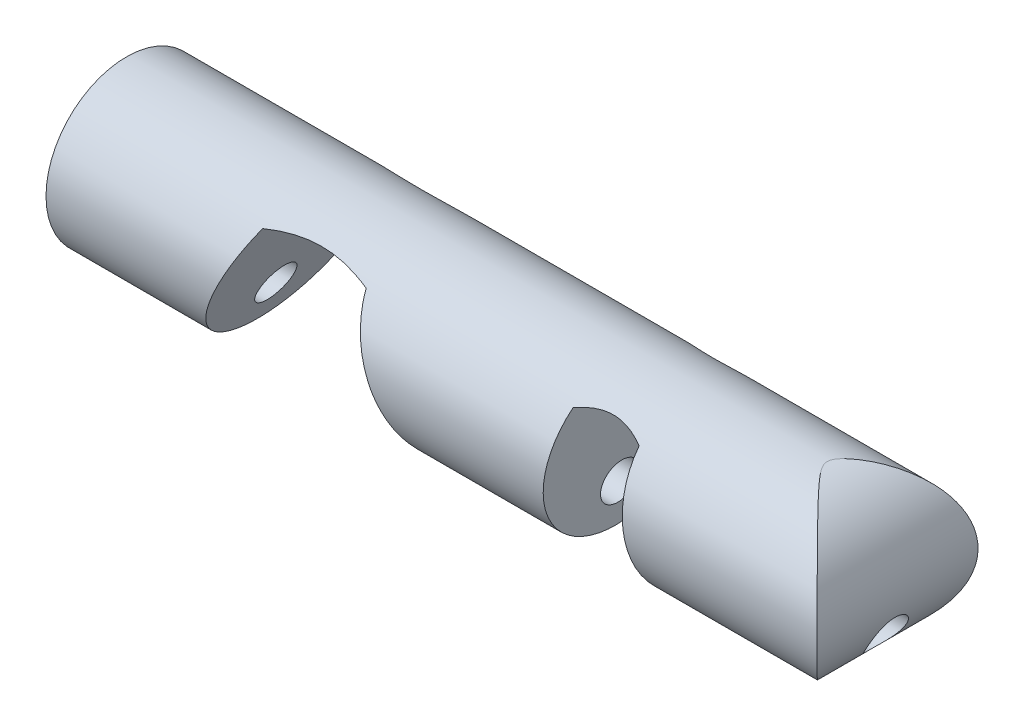
ISO-10303-21;
HEADER;
FILE_DESCRIPTION(('STEP AP214'),'2;1');
FILE_NAME('part.step','',(''),(''),'','','');
FILE_SCHEMA(('AUTOMOTIVE_DESIGN { 1 0 10303 214 1 1 1 1 }'));
ENDSEC;
DATA;
#1=APPLICATION_CONTEXT('core data for automotive mechanical design processes');
#2=APPLICATION_PROTOCOL_DEFINITION('international standard','automotive_design',2000,#1);
#3=PRODUCT_CONTEXT('',#1,'mechanical');
#4=PRODUCT('Part','Part','',(#3));
#5=PRODUCT_RELATED_PRODUCT_CATEGORY('part','',(#4));
#6=PRODUCT_DEFINITION_FORMATION('','',#4);
#7=PRODUCT_DEFINITION_CONTEXT('part definition',#1,'design');
#8=PRODUCT_DEFINITION('design','',#6,#7);
#9=PRODUCT_DEFINITION_SHAPE('','',#8);
#10=(LENGTH_UNIT() NAMED_UNIT(*) SI_UNIT(.MILLI.,.METRE.));
#11=(NAMED_UNIT(*) PLANE_ANGLE_UNIT() SI_UNIT($,.RADIAN.));
#12=(NAMED_UNIT(*) SI_UNIT($,.STERADIAN.) SOLID_ANGLE_UNIT());
#13=UNCERTAINTY_MEASURE_WITH_UNIT(LENGTH_MEASURE(1.E-05),#10,'distance_accuracy_value','');
#14=(GEOMETRIC_REPRESENTATION_CONTEXT(3) GLOBAL_UNCERTAINTY_ASSIGNED_CONTEXT((#13)) GLOBAL_UNIT_ASSIGNED_CONTEXT((#10,
#11,#12)) REPRESENTATION_CONTEXT('',''));
#15=CARTESIAN_POINT('',(0.,0.,0.));
#16=DIRECTION('',(0.,0.,1.));
#17=DIRECTION('',(1.,0.,0.));
#18=AXIS2_PLACEMENT_3D('',#15,#16,#17);
#19=CARTESIAN_POINT('',(75.052628504893,8.76,17.52));
#20=DIRECTION('',(0.,0.,-1.));
#21=DIRECTION('',(-1.,0.,0.));
#22=AXIS2_PLACEMENT_3D('',#19,#20,#21);
#23=CYLINDRICAL_SURFACE('',#22,8.83688);
#24=CARTESIAN_POINT('',(82.7305073222748,4.385,10.8603343541894));
#25=CARTESIAN_POINT('',(82.6418825477803,4.22948909983344,10.8603289897596));
#26=CARTESIAN_POINT('',(82.5484166884232,4.07657236737348,10.8430338857957));
#27=CARTESIAN_POINT('',(82.3556137555325,3.78122817893827,10.7773941748288));
#28=CARTESIAN_POINT('',(82.256262034808,3.63882905785127,10.728968876329));
#29=CARTESIAN_POINT('',(82.0662630028006,3.3820582066308,10.6102524427192));
#30=CARTESIAN_POINT('',(81.9757571676628,3.26630883927302,10.5426835227048));
#31=CARTESIAN_POINT('',(81.7972180751892,3.04854631489449,10.3858178199671));
#32=CARTESIAN_POINT('',(81.7091817445868,2.94651542512164,10.2965495138967));
#33=CARTESIAN_POINT('',(81.5592767415154,2.77972858799072,10.1186355735063));
#34=CARTESIAN_POINT('',(81.495941192204,2.71172830946379,10.034261943316));
#35=CARTESIAN_POINT('',(81.3771455166644,2.58762042111292,9.8522116935585));
#36=CARTESIAN_POINT('',(81.3216729844444,2.53149400662238,9.75455651720067));
#37=CARTESIAN_POINT('',(81.2355997813757,2.44620248573431,9.57234155700086));
#38=CARTESIAN_POINT('',(81.2022480396224,2.41380489989665,9.49060964036532));
#39=CARTESIAN_POINT('',(81.1451048142264,2.35892551474797,9.32068951300801));
#40=CARTESIAN_POINT('',(81.1213034792463,2.33643349539934,9.23250806665736));
#41=CARTESIAN_POINT('',(81.0855238204335,2.3028138276586,9.05070902119419));
#42=CARTESIAN_POINT('',(81.0736564664324,2.29179281155989,8.95704881607381));
#43=CARTESIAN_POINT('',(81.0637299065938,2.2825648518122,8.76838488024738));
#44=CARTESIAN_POINT('',(81.0656616183598,2.28434947962984,8.67338207432122));
#45=CARTESIAN_POINT('',(81.0818360632384,2.29941295502008,8.49849913811101));
#46=CARTESIAN_POINT('',(81.0943800837047,2.31110614017379,8.41831012053807));
#47=CARTESIAN_POINT('',(81.128329862177,2.34308153113208,8.26162649999527));
#48=CARTESIAN_POINT('',(81.149740632616,2.36336859526283,8.1851340140561));
#49=CARTESIAN_POINT('',(81.2089106762819,2.42021636206259,8.01013427415443));
#50=CARTESIAN_POINT('',(81.2497837039491,2.46001220476138,7.91373725045299));
#51=CARTESIAN_POINT('',(81.3409296290045,2.55098411834229,7.73129364097562));
#52=CARTESIAN_POINT('',(81.3912239496966,2.60218617732309,7.64527139437385));
#53=CARTESIAN_POINT('',(81.5173394235654,2.73430462363473,7.45441660121319));
#54=CARTESIAN_POINT('',(81.5957914145142,2.81925491245959,7.35412337181155));
#55=CARTESIAN_POINT('',(81.7582222144931,3.00321369452883,7.17293888835699));
#56=CARTESIAN_POINT('',(81.8422055741971,3.10223384259064,7.092063870353));
#57=CARTESIAN_POINT('',(82.013532062073,3.3143395662943,6.9484236983106));
#58=CARTESIAN_POINT('',(82.1009087807496,3.42767059736922,6.88606106379099));
#59=CARTESIAN_POINT('',(82.2741751710406,3.66477783987207,6.78277828621183));
#60=CARTESIAN_POINT('',(82.3600647797533,3.78855449183295,6.74185904802994));
#61=CARTESIAN_POINT('',(82.5354351413863,4.05618348654004,6.68062326808954));
#62=CARTESIAN_POINT('',(82.62451328257,4.2008337897419,6.66256236100498));
#63=CARTESIAN_POINT('',(82.7943252949616,4.49556081487769,6.65741384396276));
#64=CARTESIAN_POINT('',(82.8750644415991,4.64563402402768,6.67030652535162));
#65=CARTESIAN_POINT('',(83.0169749492803,4.92832006853769,6.72663930008489));
#66=CARTESIAN_POINT('',(83.0793234857902,5.06102254734941,6.76653103194445));
#67=CARTESIAN_POINT('',(83.1649072913004,5.25479959355708,6.84694878544776));
#68=CARTESIAN_POINT('',(83.1921135694644,5.3185164649489,6.87718736239776));
#69=CARTESIAN_POINT('',(83.2437976433463,5.44341237215698,6.94445663719387));
#70=CARTESIAN_POINT('',(83.2682759074005,5.50459184244995,6.98148616629541));
#71=CARTESIAN_POINT('',(83.3306836163467,5.66548250894327,7.09064624382825));
#72=CARTESIAN_POINT('',(83.365958773354,5.76201641322781,7.16914188509663));
#73=CARTESIAN_POINT('',(83.4283003368033,5.94085358701718,7.34355181941571));
#74=CARTESIAN_POINT('',(83.4553708169608,6.0231639099367,7.43945743027114));
#75=CARTESIAN_POINT('',(83.4998078479147,6.1637346079144,7.63707510653263));
#76=CARTESIAN_POINT('',(83.5177974769587,6.2234323290349,7.73762714288589));
#77=CARTESIAN_POINT('',(83.547726386847,6.32553751650441,7.94797799604646));
#78=CARTESIAN_POINT('',(83.5596668584919,6.36794838551661,8.05777498798118));
#79=CARTESIAN_POINT('',(83.5776944116788,6.4330244393105,8.28032605776903));
#80=CARTESIAN_POINT('',(83.5839287411399,6.45618483879865,8.3929237953444));
#81=CARTESIAN_POINT('',(83.5913475593986,6.48383328684017,8.62055233595946));
#82=CARTESIAN_POINT('',(83.5925322349425,6.4883220259083,8.73558304886479));
#83=CARTESIAN_POINT('',(83.5899123327268,6.47849692402837,8.96421850297747));
#84=CARTESIAN_POINT('',(83.5861319499631,6.46427426416021,9.07782745589149));
#85=CARTESIAN_POINT('',(83.5734573722654,6.41767205646086,9.30095951068582));
#86=CARTESIAN_POINT('',(83.5645633152087,6.38529299817111,9.4104827226429));
#87=CARTESIAN_POINT('',(83.541315398509,6.30349036301353,9.62238031350053));
#88=CARTESIAN_POINT('',(83.5269600745896,6.25406221527092,9.72475276641689));
#89=CARTESIAN_POINT('',(83.4923668034014,6.13992246453235,9.91947712654465));
#90=CARTESIAN_POINT('',(83.4721291880813,6.0752117240002,10.0118295987985));
#91=CARTESIAN_POINT('',(83.4252417223455,5.93237471298572,10.1846703876465));
#92=CARTESIAN_POINT('',(83.3985513181204,5.85416452914053,10.2650782601715));
#93=CARTESIAN_POINT('',(83.3386221820541,5.68744551993713,10.4114697491854));
#94=CARTESIAN_POINT('',(83.305382397369,5.598935039695,10.4774510429305));
#95=CARTESIAN_POINT('',(83.2313665950711,5.41200424982762,10.595550351054));
#96=CARTESIAN_POINT('',(83.1903994972544,5.31337058063197,10.6472093117794));
#97=CARTESIAN_POINT('',(83.1020328956822,5.11176186140506,10.7336395848435));
#98=CARTESIAN_POINT('',(83.0546348320475,5.00878778689283,10.7684146701196));
#99=CARTESIAN_POINT('',(82.9623788629551,4.81847912073286,10.8170630239948));
#100=CARTESIAN_POINT('',(82.9183792054881,4.73134926637305,10.8334288912333));
#101=CARTESIAN_POINT('',(82.8269148632565,4.55754914590985,10.8550674851889));
#102=CARTESIAN_POINT('',(82.7794492774734,4.47087900564208,10.8603373166306));
#103=CARTESIAN_POINT('',(82.7305073222748,4.385,10.8603343541894));
#104=B_SPLINE_CURVE_WITH_KNOTS('',3,(#24,#25,#26,#27,#28,#29,#30,#31,#32,#33,#34,#35,#36,#37,
#38,#39,#40,#41,#42,#43,#44,#45,#46,#47,#48,#49,#50,#51,#52,#53,#54,#55,#56,#57,#58,#59,#60,#61,
#62,#63,#64,#65,#66,#67,#68,#69,#70,#71,#72,#73,#74,#75,#76,#77,#78,#79,#80,#81,#82,#83,#84,#85,
#86,#87,#88,#89,#90,#91,#92,#93,#94,#95,#96,#97,#98,#99,#100,#101,#102,#103),.UNSPECIFIED.,.T.,
.F.,(4,2,2,2,2,2,2,2,2,2,2,2,2,2,2,2,2,2,2,2,2,2,2,2,2,2,2,2,2,2,2,2,2,2,2,2,2,2,2,4),(0.,
0.536514484333212,1.07442528755682,1.55767123841566,2.04028640504517,2.41562824986043,
2.7903711397879,3.07144648651421,3.35223115131984,3.63560323912772,3.91878883167357,
4.16371084198171,4.40877149775317,4.74295161836491,5.07790107234247,5.53468541227226,
5.99185036119025,6.45832911763825,6.92482755717284,7.43447329424806,7.94379461765657,
8.39660036042586,8.62303265457772,8.84942601551665,9.23511515451391,9.62061247956308,
9.97380589054202,10.3269297469692,10.6706607563448,11.0143790537581,11.3564285922764,
11.698468908736,12.0406009978513,12.3827137835623,12.7270352450948,13.0714121031667,
13.4258056317951,13.7801199297563,14.0763262575525,14.3726098645393),.UNSPECIFIED.);
#105=CARTESIAN_POINT('',(82.7305073222748,4.385,10.8603343541894));
#106=VERTEX_POINT('',#105);
#107=EDGE_CURVE('E161',#106,#106,#104,.T.);
#108=ORIENTED_EDGE('',*,*,#107,.F.);
#109=EDGE_LOOP('',(#108));
#110=FACE_BOUND('',#109,.T.);
#111=CARTESIAN_POINT('',(83.889508504893,8.76,17.515));
#112=CARTESIAN_POINT('',(83.8895068211861,8.56403368024826,17.5149983140902));
#113=CARTESIAN_POINT('',(83.8829760740916,8.36803999616261,17.508406616169));
#114=CARTESIAN_POINT('',(83.8569933279004,7.97777458870988,17.4821797683285));
#115=CARTESIAN_POINT('',(83.8375388894781,7.78350319743889,17.462542156014));
#116=CARTESIAN_POINT('',(83.7861102117679,7.39817879725484,17.4106238067874));
#117=CARTESIAN_POINT('',(83.7541255134791,7.20712861639993,17.3783325078442));
#118=CARTESIAN_POINT('',(83.6782924213329,6.82987169717925,17.3017611161471));
#119=CARTESIAN_POINT('',(83.6344442833659,6.64366485443925,17.2574812819817));
#120=CARTESIAN_POINT('',(83.536049273225,6.27856440423563,17.1580981950134));
#121=CARTESIAN_POINT('',(83.4815788249547,6.09962898505299,17.1030722529419));
#122=CARTESIAN_POINT('',(83.362627520631,5.74856639196798,16.9828787408544));
#123=CARTESIAN_POINT('',(83.2981429126793,5.57644180025862,16.9177073697366));
#124=CARTESIAN_POINT('',(83.1601272369957,5.23977167244921,16.7781804328318));
#125=CARTESIAN_POINT('',(83.0865978625866,5.07522472559867,16.7038265861386));
#126=CARTESIAN_POINT('',(82.9313994650925,4.75409987366017,16.5468317563161));
#127=CARTESIAN_POINT('',(82.849728548275,4.59752383546961,16.4641888451128));
#128=CARTESIAN_POINT('',(82.6442098531772,4.23021627299941,16.2561352745501));
#129=CARTESIAN_POINT('',(82.5167802703297,4.02354697131906,16.1270637883946));
#130=CARTESIAN_POINT('',(82.2498177451843,3.62696102260554,15.8564498769913));
#131=CARTESIAN_POINT('',(82.1102836587051,3.43704596270121,15.7149062727933));
#132=CARTESIAN_POINT('',(81.8207143513828,3.07338189843337,15.4208721361971));
#133=CARTESIAN_POINT('',(81.6706522598865,2.89967710742438,15.2683535648997));
#134=CARTESIAN_POINT('',(81.3621135818125,2.56871271221246,14.9543544952153));
#135=CARTESIAN_POINT('',(81.2036370267476,2.41145304642767,14.7928740303914));
#136=CARTESIAN_POINT('',(80.8173967224142,2.05545354183353,14.3986388759159));
#137=CARTESIAN_POINT('',(80.5864410311946,1.86404374756105,14.1623724515345));
#138=CARTESIAN_POINT('',(80.1146127330812,1.51060776974935,13.6779577938708));
#139=CARTESIAN_POINT('',(79.873735224585,1.34859632856547,13.4298036776885));
#140=CARTESIAN_POINT('',(79.3859604440229,1.05326734154029,12.9243377486214));
#141=CARTESIAN_POINT('',(79.1390832168433,0.919865849736173,12.6670553821579));
#142=CARTESIAN_POINT('',(78.6418713966203,0.680163703431738,12.143667548509));
#143=CARTESIAN_POINT('',(78.3915387611453,0.57384831877713,11.8775669662726));
#144=CARTESIAN_POINT('',(77.9792739498844,0.420014832580509,11.4300924822244));
#145=CARTESIAN_POINT('',(77.8170013482802,0.364929474661947,11.251584351313));
#146=CARTESIAN_POINT('',(77.4942933242538,0.265459415539332,10.8880627293298));
#147=CARTESIAN_POINT('',(77.333872769358,0.221134778728307,10.7030190419651));
#148=CARTESIAN_POINT('',(77.0985103811552,0.162820700848479,10.4177212618542));
#149=CARTESIAN_POINT('',(77.0205433883202,0.144672244832215,10.32080949075));
#150=CARTESIAN_POINT('',(76.8680111170867,0.111247921331125,10.1235105322944));
#151=CARTESIAN_POINT('',(76.7934526005667,0.0959775909295469,10.0231170770885));
#152=CARTESIAN_POINT('',(76.6512198690559,0.0686169805874295,9.81852088376718));
#153=CARTESIAN_POINT('',(76.5834875455935,0.0564981658867024,9.71436280708235));
#154=CARTESIAN_POINT('',(76.4594674917529,0.0356011177918325,9.4992655022113));
#155=CARTESIAN_POINT('',(76.4031314078908,0.0268086265410139,9.38835763759737));
#156=CARTESIAN_POINT('',(76.3297509892792,0.0158449661377982,9.20143344149082));
#157=CARTESIAN_POINT('',(76.3059171314902,0.012427465733191,9.12826117520182));
#158=CARTESIAN_POINT('',(76.2705146339309,0.00742717013565205,8.97911652949469));
#159=CARTESIAN_POINT('',(76.2588904250377,0.00583605949188387,8.90315847906342));
#160=CARTESIAN_POINT('',(76.2503945946168,0.00466817208429408,8.74972507973463));
#161=CARTESIAN_POINT('',(76.2536428396018,0.0051077622769684,8.67224243190592));
#162=CARTESIAN_POINT('',(76.2743602594527,0.00797663813970976,8.51911419771936));
#163=CARTESIAN_POINT('',(76.2918791867101,0.0104128850073729,8.44347599341133));
#164=CARTESIAN_POINT('',(76.3496345286127,0.0187522334446661,8.25654440734399));
#165=CARTESIAN_POINT('',(76.3969916167427,0.02580874029256,8.14761638614061));
#166=CARTESIAN_POINT('',(76.5051396988384,0.0431372238020381,7.93683015484739));
#167=CARTESIAN_POINT('',(76.565997527545,0.0534253074678374,7.83501055217916));
#168=CARTESIAN_POINT('',(76.6996782898048,0.0776825314741614,7.62912481554857));
#169=CARTESIAN_POINT('',(76.7730530780958,0.0918675098788279,7.52544868181811));
#170=CARTESIAN_POINT('',(76.9244529445188,0.123290981786435,7.32199442636868));
#171=CARTESIAN_POINT('',(77.0024813926744,0.140531706418286,7.22221921829603));
#172=CARTESIAN_POINT('',(77.2408222194433,0.196775586473485,6.92651750071572));
#173=CARTESIAN_POINT('',(77.4050886021412,0.240248408207564,6.73463728656934));
#174=CARTESIAN_POINT('',(77.7377007998,0.339118139128091,6.3564760070198));
#175=CARTESIAN_POINT('',(77.9060589663498,0.394556591073622,6.1702170930872));
#176=CARTESIAN_POINT('',(78.2433972491988,0.517329471610953,5.80265288233496));
#177=CARTESIAN_POINT('',(78.4123764545809,0.584650469350202,5.62134225683739));
#178=CARTESIAN_POINT('',(78.8434921284301,0.772396194004763,5.16287691625182));
#179=CARTESIAN_POINT('',(79.1050314241035,0.901499568539666,4.88865560847638));
#180=CARTESIAN_POINT('',(79.6220669346327,1.19042069119623,4.35037491556998));
#181=CARTESIAN_POINT('',(79.8775582687881,1.35026235571043,4.08632363666901));
#182=CARTESIAN_POINT('',(80.3780165549616,1.70139836152384,3.57125986092885));
#183=CARTESIAN_POINT('',(80.6230138751761,1.89259294481193,3.32020922900587));
#184=CARTESIAN_POINT('',(81.0994219933155,2.30813725404927,2.83329825304388));
#185=CARTESIAN_POINT('',(81.330843697202,2.53245984252643,2.5974257005174));
#186=CARTESIAN_POINT('',(81.6888074505616,2.92119643920475,2.23320234913496));
#187=CARTESIAN_POINT('',(81.8210229401135,3.07480912212246,2.09882499915204));
#188=CARTESIAN_POINT('',(82.0776239623615,3.39511450691122,1.83824776866691));
#189=CARTESIAN_POINT('',(82.2020078600824,3.56180992381079,1.71204959554389));
#190=CARTESIAN_POINT('',(82.4414302493913,3.90816107720981,1.46929575516475));
#191=CARTESIAN_POINT('',(82.5564767586488,4.08780543918266,1.35273181373746));
#192=CARTESIAN_POINT('',(82.7757571525328,4.45996144854522,1.13067505423481));
#193=CARTESIAN_POINT('',(82.8799973795534,4.65246543803569,1.02517574170746));
#194=CARTESIAN_POINT('',(83.0586648454496,5.01472547550885,0.84442377102174));
#195=CARTESIAN_POINT('',(83.1351021882065,5.18247021803406,0.767123697764126));
#196=CARTESIAN_POINT('',(83.2785325376162,5.52587735198189,0.622114039054323));
#197=CARTESIAN_POINT('',(83.3455301361784,5.70153583854345,0.554399790556312));
#198=CARTESIAN_POINT('',(83.4690994692019,6.0601084917611,0.429535381483397));
#199=CARTESIAN_POINT('',(83.5256731474293,6.2430212979456,0.3723832513664));
#200=CARTESIAN_POINT('',(83.6274374466417,6.61516781931739,0.269594966042756));
#201=CARTESIAN_POINT('',(83.6726279792584,6.80440158356192,0.223958900236288));
#202=CARTESIAN_POINT('',(83.7510360252646,7.18932933767169,0.144786676257981));
#203=CARTESIAN_POINT('',(83.7841642161825,7.38506025955797,0.111340785424553));
#204=CARTESIAN_POINT('',(83.8372728782301,7.78010900755169,0.0577263226682786));
#205=CARTESIAN_POINT('',(83.8572532940763,7.97942684873769,0.0375578065737386));
#206=CARTESIAN_POINT('',(83.8836035871023,8.37979335197477,0.0109599926992887));
#207=CARTESIAN_POINT('',(83.8899791316575,8.58084125827649,0.00452497396204411));
#208=CARTESIAN_POINT('',(83.8889838561818,8.98285703360934,0.00552955321969746));
#209=CARTESIAN_POINT('',(83.8816143309665,9.18382490839583,0.0129678443185653));
#210=CARTESIAN_POINT('',(83.8549724966505,9.56032753673578,0.0398601264478838));
#211=CARTESIAN_POINT('',(83.8371976770032,9.7360805898222,0.0578024378116343));
#212=CARTESIAN_POINT('',(83.791391695422,10.0849225494972,0.104044303447681));
#213=CARTESIAN_POINT('',(83.7633572017328,10.2580105715871,0.132347222253461));
#214=CARTESIAN_POINT('',(83.6975142895574,10.6003181289989,0.198829039953102));
#215=CARTESIAN_POINT('',(83.6597088651383,10.769538832109,0.237004913519428));
#216=CARTESIAN_POINT('',(83.5748944757146,11.1033092950606,0.322664512107922));
#217=CARTESIAN_POINT('',(83.5278818629546,11.2678571739149,0.370151926237579));
#218=CARTESIAN_POINT('',(83.4233792128578,11.5976063576883,0.475731589132485));
#219=CARTESIAN_POINT('',(83.3655597621571,11.7625963283493,0.534157396088307));
#220=CARTESIAN_POINT('',(83.2415133557221,12.0860573749088,0.659537378067317));
#221=CARTESIAN_POINT('',(83.1752837053432,12.2445263398222,0.726494286495268));
#222=CARTESIAN_POINT('',(82.9651494795223,12.7094278295565,0.939001701829175));
#223=CARTESIAN_POINT('',(82.8097534381222,13.0054974522093,1.09623554179624));
#224=CARTESIAN_POINT('',(82.5132578365619,13.5026795527189,1.3965095107255));
#225=CARTESIAN_POINT('',(82.3771083403549,13.7099572350713,1.53447842391079));
#226=CARTESIAN_POINT('',(82.0926728108166,14.1067528566459,1.8229702073851));
#227=CARTESIAN_POINT('',(81.9443848105918,14.2962679069405,1.97349511229175));
#228=CARTESIAN_POINT('',(81.6373709269073,14.6581439785831,2.28549717926167));
#229=CARTESIAN_POINT('',(81.4786169945032,14.8304555104383,2.44700381221908));
#230=CARTESIAN_POINT('',(81.1528569012348,15.157731329138,2.77891562297167));
#231=CARTESIAN_POINT('',(80.985851004604,15.3126961709167,2.94932051584867));
#232=CARTESIAN_POINT('',(80.5804171161852,15.661459188933,3.36383818213732));
#233=CARTESIAN_POINT('',(80.3389421561631,15.8476687304939,3.61137582586821));
#234=CARTESIAN_POINT('',(79.8467095103069,16.1894741076553,4.11818680286738));
#235=CARTESIAN_POINT('',(79.5959470033034,16.3450537709566,4.3774662473136));
#236=CARTESIAN_POINT('',(79.0890201070976,16.6264952768847,4.90543886699583));
#237=CARTESIAN_POINT('',(78.8328683403822,16.7524196173755,5.17411084913657));
#238=CARTESIAN_POINT('',(78.4473006259484,16.9200429609359,5.58423499666061));
#239=CARTESIAN_POINT('',(78.3185802752206,16.9723653086857,5.72210113288503));
#240=CARTESIAN_POINT('',(78.0613669574963,17.0700453859499,6.00048178275418));
#241=CARTESIAN_POINT('',(77.9328739746439,17.1154036217015,6.14099610306193));
#242=CARTESIAN_POINT('',(77.6600995385349,17.2048069103802,6.44408544618232));
#243=CARTESIAN_POINT('',(77.5159921406678,17.2478742338756,6.60710814371745));
#244=CARTESIAN_POINT('',(77.2316938933082,17.3252675627294,6.93917127016358));
#245=CARTESIAN_POINT('',(77.09151149848,17.3595758236579,7.10822313631764));
#246=CARTESIAN_POINT('',(76.8467166662164,17.4135648109359,7.42341582473554));
#247=CARTESIAN_POINT('',(76.7403726946228,17.4347830243827,7.5678865559533));
#248=CARTESIAN_POINT('',(76.5929218533731,17.461751989795,7.79295301918594));
#249=CARTESIAN_POINT('',(76.5458301947368,17.4699252278472,7.86927499600908));
#250=CARTESIAN_POINT('',(76.4581347657452,17.4845029196483,8.02566650054154));
#251=CARTESIAN_POINT('',(76.4175205214301,17.4909102413513,8.10572970193362));
#252=CARTESIAN_POINT('',(76.3501121014416,17.5011691746648,8.26248485897657));
#253=CARTESIAN_POINT('',(76.3223508221514,17.5052103308113,8.33873235245424));
#254=CARTESIAN_POINT('',(76.279545325658,17.5113203357439,8.49459806795361));
#255=CARTESIAN_POINT('',(76.2644368884035,17.5133991514047,8.57419708766375));
#256=CARTESIAN_POINT('',(76.2503321430494,17.5153428045602,8.73590946791032));
#257=CARTESIAN_POINT('',(76.2515281711677,17.5151812126258,8.81804141852085));
#258=CARTESIAN_POINT('',(76.2701888232029,17.512603157179,8.98050259620924));
#259=CARTESIAN_POINT('',(76.2877060945342,17.510179396548,9.06082512749363));
#260=CARTESIAN_POINT('',(76.3447077312437,17.5019713001624,9.25029651773718));
#261=CARTESIAN_POINT('',(76.3903157324542,17.4952053544068,9.35744961732787));
#262=CARTESIAN_POINT('',(76.4949140708848,17.4785490862363,9.56489007458645));
#263=CARTESIAN_POINT('',(76.5539734914994,17.4686425276423,9.66513838217158));
#264=CARTESIAN_POINT('',(76.6830967737509,17.4454241157792,9.86647224546402));
#265=CARTESIAN_POINT('',(76.7536089780047,17.4319432172489,9.96724516208998));
#266=CARTESIAN_POINT('',(76.8992490123162,17.402106565368,10.1649914458618));
#267=CARTESIAN_POINT('',(76.9743801356851,17.3857487449264,10.2619620193111));
#268=CARTESIAN_POINT('',(77.2040413521685,17.3324257864513,10.549322513236));
#269=CARTESIAN_POINT('',(77.3625456448967,17.2912613862607,10.7357448235704));
#270=CARTESIAN_POINT('',(77.6837824287043,17.1977577664411,11.1031078339543));
#271=CARTESIAN_POINT('',(77.8465278425158,17.1453797095801,11.2840269214541));
#272=CARTESIAN_POINT('',(78.1728567441713,17.0294960807174,11.6410829274434));
#273=CARTESIAN_POINT('',(78.3364390604402,16.9660033055393,11.8172250793366));
#274=CARTESIAN_POINT('',(78.765278591336,16.7843281373795,12.2747051828281));
#275=CARTESIAN_POINT('',(79.0300580781378,16.6567966860722,12.5528449623551));
#276=CARTESIAN_POINT('',(79.553784233084,16.3704720626718,13.0988655504921));
#277=CARTESIAN_POINT('',(79.8127259473486,16.2116533767486,13.3667377718115));
#278=CARTESIAN_POINT('',(80.320158229091,15.8619883242427,13.8893607343211));
#279=CARTESIAN_POINT('',(80.5686789975626,15.6712438564646,14.1441499547763));
#280=CARTESIAN_POINT('',(81.0521300115475,15.2559875813344,14.6384538909025));
#281=CARTESIAN_POINT('',(81.2870714292591,15.0315040959418,14.8779811801943));
#282=CARTESIAN_POINT('',(81.6499407291151,14.6427060320501,15.2472773177817));
#283=CARTESIAN_POINT('',(81.7836031260126,14.4894692119797,15.3831507537862));
#284=CARTESIAN_POINT('',(82.0430913486732,14.1698281822382,15.6467031893457));
#285=CARTESIAN_POINT('',(82.1689178054531,14.0034250352887,15.7743828487591));
#286=CARTESIAN_POINT('',(82.4112677812393,13.6574938211244,16.0201351735994));
#287=CARTESIAN_POINT('',(82.5277981179858,13.4779755610939,16.1382148808351));
#288=CARTESIAN_POINT('',(82.7500928322657,13.1058520995796,16.3633447226852));
#289=CARTESIAN_POINT('',(82.855860426843,12.9132508375517,16.4703981532327));
#290=CARTESIAN_POINT('',(83.0371859329941,12.5508709508793,16.6538515126798));
#291=CARTESIAN_POINT('',(83.1147676097506,12.3831470863439,16.7323134614125));
#292=CARTESIAN_POINT('',(83.2604902622356,12.0396686075976,16.8796483679713));
#293=CARTESIAN_POINT('',(83.3286363055669,11.8639183720959,16.9485264730981));
#294=CARTESIAN_POINT('',(83.4544486854976,11.5051709926443,17.0756624992705));
#295=CARTESIAN_POINT('',(83.5121249298766,11.3221809018042,17.1339304610707));
#296=CARTESIAN_POINT('',(83.6160802293503,10.949769103153,17.2389349083822));
#297=CARTESIAN_POINT('',(83.6623616659963,10.7603487487209,17.2856738035094));
#298=CARTESIAN_POINT('',(83.7331358806195,10.4218257802419,17.3571392584594));
#299=CARTESIAN_POINT('',(83.7601930152352,10.2737980371595,17.3844574899838));
#300=CARTESIAN_POINT('',(83.8068317198992,9.97538873656125,17.4315431909945));
#301=CARTESIAN_POINT('',(83.8264142242826,9.82500747568506,17.4513116042147));
#302=CARTESIAN_POINT('',(83.8578558885916,9.52258407047027,17.4830505472062));
#303=CARTESIAN_POINT('',(83.8697133021197,9.37054155846908,17.4950193137254));
#304=CARTESIAN_POINT('',(83.8855393522345,9.06567145290114,17.5109937743315));
#305=CARTESIAN_POINT('',(83.8895098181013,8.91284404962668,17.5150013149264));
#306=CARTESIAN_POINT('',(83.889508504893,8.76,17.515));
#307=B_SPLINE_CURVE_WITH_KNOTS('',3,(#111,#112,#113,#114,#115,#116,#117,#118,#119,#120,#121,
#122,#123,#124,#125,#126,#127,#128,#129,#130,#131,#132,#133,#134,#135,#136,#137,#138,#139,#140,
#141,#142,#143,#144,#145,#146,#147,#148,#149,#150,#151,#152,#153,#154,#155,#156,#157,#158,#159,
#160,#161,#162,#163,#164,#165,#166,#167,#168,#169,#170,#171,#172,#173,#174,#175,#176,#177,#178,
#179,#180,#181,#182,#183,#184,#185,#186,#187,#188,#189,#190,#191,#192,#193,#194,#195,#196,#197,
#198,#199,#200,#201,#202,#203,#204,#205,#206,#207,#208,#209,#210,#211,#212,#213,#214,#215,#216,
#217,#218,#219,#220,#221,#222,#223,#224,#225,#226,#227,#228,#229,#230,#231,#232,#233,#234,#235,
#236,#237,#238,#239,#240,#241,#242,#243,#244,#245,#246,#247,#248,#249,#250,#251,#252,#253,#254,
#255,#256,#257,#258,#259,#260,#261,#262,#263,#264,#265,#266,#267,#268,#269,#270,#271,#272,#273,
#274,#275,#276,#277,#278,#279,#280,#281,#282,#283,#284,#285,#286,#287,#288,#289,#290,#291,#292,
#293,#294,#295,#296,#297,#298,#299,#300,#301,#302,#303,#304,#305,#306),.UNSPECIFIED.,.T.,.F.,(4,
2,2,2,2,2,2,2,2,2,2,2,2,2,2,2,2,2,2,2,2,2,2,2,2,2,2,2,2,2,2,2,2,2,2,2,2,2,2,2,2,2,2,2,2,2,2,2,2,
2,2,2,2,2,2,2,2,2,2,2,2,2,2,2,2,2,2,2,2,2,2,2,2,2,2,2,2,2,2,2,2,2,2,2,2,2,2,2,2,2,2,2,2,2,2,2,2,
4),(0.,0.587729241090625,1.17556944665078,1.76390137114639,2.35222060653221,2.93645363880972,
3.52090608988702,4.10524928832292,4.68972872424854,5.51341528961936,6.33717979919611,
7.16312918565708,7.98907547908552,9.1329083292064,10.2773132000807,11.4183128256815,
12.5586906140405,13.3008050368327,14.0469711827477,14.4239911285261,14.8017291615634,
15.1759175574939,15.5484833637458,15.7788149508851,16.0080936388638,16.2392234668956,
16.47116255745,16.8261118001916,17.1828590503833,17.5659688261661,17.9493594875808,
18.717700848245,19.488753953964,20.2589410544236,21.458608944354,22.6592140585709,
23.8560707061789,25.0519523077699,25.7809602297439,26.5101198430809,27.2386465801666,
27.9667432822429,28.5658589427168,29.1646821531251,29.7633935866964,30.3621096679721,
30.9651732086789,31.5682392851131,32.1710540934854,32.7738121182568,33.305871337277,
33.8381034922419,34.3701727504121,34.9024532347626,35.4548954768044,36.0075151711473,
37.1122881443811,37.962619667096,38.8130892492363,39.6659388581921,40.5187611760215,
41.6953140861253,42.8724865492944,44.0471554939063,44.6342580129109,45.2213178338785,
45.8864888261051,46.5529968406798,47.0941620400011,47.3641176467132,47.6336322106157,
47.8766053134093,48.1183375902894,48.3629239137599,48.6083019406257,48.9563176706071,
49.3061627272164,49.6770602801655,50.0482254228247,50.7920870620984,51.5385679083077,
52.2841948867964,53.4967450240075,54.7102880845215,55.9200292187662,57.1287604591166,
57.8619109994013,58.5950024235952,59.327551161608,60.059880289515,60.6616180355077,
61.2630313416935,61.8638725173077,62.464588008374,62.923047875061,63.3814504150929,
63.8399565494415,64.2983563265364),.UNSPECIFIED.);
#308=CARTESIAN_POINT('',(83.889508504893,8.76,17.515));
#309=VERTEX_POINT('',#308);
#310=EDGE_CURVE('E12',#309,#309,#307,.T.);
#311=ORIENTED_EDGE('',*,*,#310,.T.);
#312=EDGE_LOOP('',(#311));
#313=FACE_BOUND('',#312,.T.);
#314=ADVANCED_FACE('F40',(#110,#313),#23,.T.);
#315=CARTESIAN_POINT('',(83.889508504893,8.76,8.76));
#316=DIRECTION('',(-1.,0.,0.));
#317=DIRECTION('',(0.,0.,1.));
#318=AXIS2_PLACEMENT_3D('',#315,#316,#317);
#319=CYLINDRICAL_SURFACE('',#318,8.755);
#320=CARTESIAN_POINT('',(0.,8.76,8.76));
#321=DIRECTION('',(-1.,0.,0.));
#322=DIRECTION('',(0.,0.,1.));
#323=AXIS2_PLACEMENT_3D('',#320,#321,#322);
#324=CIRCLE('',#323,8.755);
#325=CARTESIAN_POINT('',(0.,8.76,17.515));
#326=VERTEX_POINT('',#325);
#327=EDGE_CURVE('E90',#326,#326,#324,.T.);
#328=ORIENTED_EDGE('',*,*,#327,.F.);
#329=EDGE_LOOP('',(#328));
#330=FACE_BOUND('',#329,.T.);
#331=ORIENTED_EDGE('',*,*,#310,.F.);
#332=EDGE_LOOP('',(#331));
#333=FACE_BOUND('',#332,.T.);
#334=CARTESIAN_POINT('',(54.782126974306,14.9436480400978,14.9577836293465));
#335=CARTESIAN_POINT('',(54.9481419287472,15.0126521852898,14.8889564229663));
#336=CARTESIAN_POINT('',(55.1169513842162,15.0772318502475,14.822203908392));
#337=CARTESIAN_POINT('',(55.4603255805799,15.1971890183752,14.6946643559652));
#338=CARTESIAN_POINT('',(55.6348989424211,15.2525519127246,14.6338868499229));
#339=CARTESIAN_POINT('',(55.9909702408921,15.3539370157947,14.5198532311997));
#340=CARTESIAN_POINT('',(56.1725148275483,15.3998747733926,14.4666663197342));
#341=CARTESIAN_POINT('',(56.5405991836651,15.4811871194423,14.3706710482277));
#342=CARTESIAN_POINT('',(56.7271367417531,15.516566302584,14.3278581753298));
#343=CARTESIAN_POINT('',(57.1066282348441,15.5764917195397,14.2543385585829));
#344=CARTESIAN_POINT('',(57.2996313017701,15.600908623293,14.2237767784255));
#345=CARTESIAN_POINT('',(57.6885721573732,15.6377151567595,14.1773748876961));
#346=CARTESIAN_POINT('',(57.8845099218439,15.6501048856219,14.1615346557633));
#347=CARTESIAN_POINT('',(58.2763534561192,15.6624676777068,14.1457282983843));
#348=CARTESIAN_POINT('',(58.4722535416976,15.6625082696171,14.1456758407934));
#349=CARTESIAN_POINT('',(58.863026882921,15.6503398839121,14.1612347370302));
#350=CARTESIAN_POINT('',(59.057900204471,15.6381317023801,14.1768450728875));
#351=CARTESIAN_POINT('',(59.4161349178604,15.6045048061966,14.2192467830869));
#352=CARTESIAN_POINT('',(59.5798942844674,15.5847153274396,14.2440430749845));
#353=CARTESIAN_POINT('',(59.9044948683063,15.5368497311715,14.3030838389142));
#354=CARTESIAN_POINT('',(60.0653348936519,15.5087703064431,14.3373320813814));
#355=CARTESIAN_POINT('',(60.5433584647654,15.4125089961432,14.4524639490634));
#356=CARTESIAN_POINT('',(60.855296568977,15.3323770596518,14.5456354247235));
#357=CARTESIAN_POINT('',(61.2978292052171,15.194655157614,14.6971192906554));
#358=CARTESIAN_POINT('',(61.4351722708862,15.1483477166988,14.7469956003149));
#359=CARTESIAN_POINT('',(61.7056666826726,15.0501559343904,14.8500754496768));
#360=CARTESIAN_POINT('',(61.8388361854077,14.9983020062757,14.9032602367559));
#361=CARTESIAN_POINT('',(61.9703374596822,14.9436480400978,14.9577836293465));
#362=B_SPLINE_CURVE_WITH_KNOTS('',3,(#334,#335,#336,#337,#338,#339,#340,#341,#342,#343,#344,
#345,#346,#347,#348,#349,#350,#351,#352,#353,#354,#355,#356,#357,#358,#359,#360,#361),
.UNSPECIFIED.,.F.,.F.,(4,2,2,2,2,2,2,2,2,2,2,2,2,4),(0.,0.577568998910334,1.15604491896064,
1.7394972261098,2.32269526555743,2.91260370008116,3.50250727150066,4.08918501958549,
4.67582464025416,5.17570249024975,5.6757800332033,6.67819046097227,7.13791213943595,
7.59523103247861),.UNSPECIFIED.);
#363=CARTESIAN_POINT('',(54.782126974306,14.9436480400978,14.9577836293465));
#364=VERTEX_POINT('',#363);
#365=CARTESIAN_POINT('',(61.9703374596822,14.9436480400978,14.9577836293465));
#366=VERTEX_POINT('',#365);
#367=EDGE_CURVE('E67',#364,#366,#362,.T.);
#368=ORIENTED_EDGE('',*,*,#367,.T.);
#369=CARTESIAN_POINT('',(62.7644861334523,8.76,8.76));
#370=DIRECTION('',(0.991853857418467,0.127381024976668,0.));
#371=DIRECTION('',(-0.127381024976668,0.991853857418468,0.));
#372=AXIS2_PLACEMENT_3D('',#369,#370,#371);
#373=ELLIPSE('',#372,8.82690522854541,8.755);
#374=CARTESIAN_POINT('',(61.9703374596822,14.9436480400978,2.56221637065353));
#375=VERTEX_POINT('',#374);
#376=EDGE_CURVE('E82',#366,#375,#373,.T.);
#377=ORIENTED_EDGE('',*,*,#376,.T.);
#378=CARTESIAN_POINT('',(61.9703374596822,14.9436480400978,2.56221637065352));
#379=CARTESIAN_POINT('',(61.804322505241,15.0126521852898,2.63104357703366));
#380=CARTESIAN_POINT('',(61.635513049772,15.0772318502475,2.69779609160798));
#381=CARTESIAN_POINT('',(61.2921388534083,15.1971890183752,2.82533564403477));
#382=CARTESIAN_POINT('',(61.1175654915671,15.2525519127246,2.8861131500771));
#383=CARTESIAN_POINT('',(60.7614941930961,15.3539370157947,3.00014676880032));
#384=CARTESIAN_POINT('',(60.5799496064399,15.3998747733926,3.05333368026585));
#385=CARTESIAN_POINT('',(60.2118652503231,15.4811871194423,3.14932895177233));
#386=CARTESIAN_POINT('',(60.0253276922351,15.516566302584,3.19214182467023));
#387=CARTESIAN_POINT('',(59.6458361991442,15.5764917195397,3.26566144141709));
#388=CARTESIAN_POINT('',(59.4528331322181,15.6009086232929,3.29622322157449));
#389=CARTESIAN_POINT('',(59.063892276615,15.6377151567595,3.34262511230386));
#390=CARTESIAN_POINT('',(58.8679545121443,15.6501048856219,3.35846534423667));
#391=CARTESIAN_POINT('',(58.476110977869,15.6624676777068,3.37427170161574));
#392=CARTESIAN_POINT('',(58.2802108922906,15.6625082696171,3.37432415920659));
#393=CARTESIAN_POINT('',(57.8894375510672,15.6503398839121,3.35876526296981));
#394=CARTESIAN_POINT('',(57.6945642295172,15.6381317023801,3.34315492711248));
#395=CARTESIAN_POINT('',(57.3363295161278,15.6045048061966,3.30075321691308));
#396=CARTESIAN_POINT('',(57.1725701495208,15.5847153274396,3.27595692501551));
#397=CARTESIAN_POINT('',(56.8479695656819,15.5368497311715,3.21691616108576));
#398=CARTESIAN_POINT('',(56.6871295403363,15.5087703064431,3.18266791861858));
#399=CARTESIAN_POINT('',(56.2091059692228,15.4125089961432,3.0675360509366));
#400=CARTESIAN_POINT('',(55.8971678650112,15.3323770596518,2.97436457527655));
#401=CARTESIAN_POINT('',(55.4546352287711,15.194655157614,2.82288070934463));
#402=CARTESIAN_POINT('',(55.3172921631021,15.1483477166988,2.7730043996851));
#403=CARTESIAN_POINT('',(55.0467977513156,15.0501559343904,2.66992455032318));
#404=CARTESIAN_POINT('',(54.9136282485805,14.9983020062757,2.61673976324412));
#405=CARTESIAN_POINT('',(54.782126974306,14.9436480400978,2.56221637065353));
#406=B_SPLINE_CURVE_WITH_KNOTS('',3,(#378,#379,#380,#381,#382,#383,#384,#385,#386,#387,#388,
#389,#390,#391,#392,#393,#394,#395,#396,#397,#398,#399,#400,#401,#402,#403,#404,#405),
.UNSPECIFIED.,.F.,.F.,(4,2,2,2,2,2,2,2,2,2,2,2,2,4),(0.,0.577568998910334,1.15604491896064,
1.7394972261098,2.32269526555743,2.91260370008115,3.50250727150065,4.08918501958547,
4.67582464025416,5.17570249024974,5.6757800332033,6.67819046097227,7.13791213943595,
7.59523103247861),.UNSPECIFIED.);
#407=CARTESIAN_POINT('',(54.782126974306,14.9436480400978,2.56221637065352));
#408=VERTEX_POINT('',#407);
#409=EDGE_CURVE('E85',#375,#408,#406,.T.);
#410=ORIENTED_EDGE('',*,*,#409,.T.);
#411=CARTESIAN_POINT('',(54.1372836709474,8.76,8.76));
#412=DIRECTION('',(0.994606579623065,-0.103719582386877,0.));
#413=DIRECTION('',(-0.103719582386877,-0.994606579623065,0.));
#414=AXIS2_PLACEMENT_3D('',#411,#412,#413);
#415=ELLIPSE('',#414,8.802475450462,8.755);
#416=EDGE_CURVE('E98',#364,#408,#415,.T.);
#417=ORIENTED_EDGE('',*,*,#416,.F.);
#418=EDGE_LOOP('',(#368,#377,#410,#417));
#419=FACE_BOUND('',#418,.T.);
#420=CARTESIAN_POINT('',(18.2263359061027,8.76,8.76));
#421=DIRECTION('',(-0.911255023234172,0.411842545920755,0.));
#422=DIRECTION('',(-0.411842545920755,-0.911255023234172,0.));
#423=AXIS2_PLACEMENT_3D('',#420,#421,#422);
#424=ELLIPSE('',#423,9.6076287941078,8.755);
#425=CARTESIAN_POINT('',(21.0210413255288,14.9436480400978,2.56221637065353));
#426=VERTEX_POINT('',#425);
#427=CARTESIAN_POINT('',(21.0210413255288,14.9436480400978,14.9577836293465));
#428=VERTEX_POINT('',#427);
#429=EDGE_CURVE('E101',#426,#428,#424,.T.);
#430=ORIENTED_EDGE('',*,*,#429,.T.);
#431=CARTESIAN_POINT('',(21.0210413255288,14.9436480400978,14.9577836293465));
#432=CARTESIAN_POINT('',(21.4835754609736,15.063516928079,14.8381819383388));
#433=CARTESIAN_POINT('',(21.9521561663372,15.1691793651705,14.7257962498659));
#434=CARTESIAN_POINT('',(22.9013837051218,15.3511156166875,14.5241837664884));
#435=CARTESIAN_POINT('',(23.3820635538644,15.4272969388623,14.4350301396474));
#436=CARTESIAN_POINT('',(24.3353358547765,15.5463808621789,14.2920503038971));
#437=CARTESIAN_POINT('',(24.8076095086363,15.5903689832181,14.2370821893237));
#438=CARTESIAN_POINT('',(25.5190377832405,15.63378528971,14.1823202112047));
#439=CARTESIAN_POINT('',(25.7565319377054,15.6444967570189,14.168681142332));
#440=CARTESIAN_POINT('',(26.2321148810979,15.6583629624356,14.1509891285497));
#441=CARTESIAN_POINT('',(26.4702036601764,15.661517824886,14.1469360259047));
#442=CARTESIAN_POINT('',(26.9414806558238,15.6602539336388,14.1485545153994));
#443=CARTESIAN_POINT('',(27.1746700054393,15.6559879895042,14.1540298975029));
#444=CARTESIAN_POINT('',(27.6404184447149,15.6402113593437,14.1741351412888));
#445=CARTESIAN_POINT('',(27.8729774498752,15.6286997459987,14.1887661747334));
#446=CARTESIAN_POINT('',(28.5695011927243,15.5833555449552,14.2458325991066));
#447=CARTESIAN_POINT('',(29.0317695396767,15.5387152863198,14.3014378556875));
#448=CARTESIAN_POINT('',(29.9645844915949,15.4195871356134,14.4440744898065));
#449=CARTESIAN_POINT('',(30.4348278477849,15.344080279164,14.5321675147998));
#450=CARTESIAN_POINT('',(31.3636741658014,15.1647480571697,14.7305084611775));
#451=CARTESIAN_POINT('',(31.8223079175622,15.0610086562437,14.8406888652306));
#452=CARTESIAN_POINT('',(32.2751694453581,14.9436480400978,14.9577836293465));
#453=B_SPLINE_CURVE_WITH_KNOTS('',3,(#431,#432,#433,#434,#435,#436,#437,#438,#439,#440,#441,
#442,#443,#444,#445,#446,#447,#448,#449,#450,#451,#452),.UNSPECIFIED.,.F.,.F.,(4,2,2,2,2,2,2,2,
2,2,4),(0.,1.47808321828124,2.96076680042992,4.39080804968332,5.10492348645771,5.81902717250545,
6.51859952245321,7.21826142366008,8.61920741031244,10.0707086281545,11.5178387183193),.UNSPECIFIED.);
#454=CARTESIAN_POINT('',(32.2751694453581,14.9436480400978,14.9577836293465));
#455=VERTEX_POINT('',#454);
#456=EDGE_CURVE('E59',#428,#455,#453,.T.);
#457=ORIENTED_EDGE('',*,*,#456,.T.);
#458=CARTESIAN_POINT('',(35.0369959774968,8.76,8.76));
#459=DIRECTION('',(-0.913068098566951,-0.407807120314656,0.));
#460=DIRECTION('',(-0.407807120314656,0.913068098566951,0.));
#461=AXIS2_PLACEMENT_3D('',#458,#459,#460);
#462=ELLIPSE('',#461,9.58855096760129,8.755);
#463=CARTESIAN_POINT('',(32.2751694453581,14.9436480400978,2.56221637065353));
#464=VERTEX_POINT('',#463);
#465=EDGE_CURVE('E218',#464,#455,#462,.T.);
#466=ORIENTED_EDGE('',*,*,#465,.F.);
#467=CARTESIAN_POINT('',(32.2751694453581,14.9436480400978,2.56221637065353));
#468=CARTESIAN_POINT('',(31.8126353099132,15.063516928079,2.68181806166116));
#469=CARTESIAN_POINT('',(31.3440546045497,15.1691793651705,2.7942037501341));
#470=CARTESIAN_POINT('',(30.3948270657651,15.3511156166875,2.99581623351164));
#471=CARTESIAN_POINT('',(29.9141472170225,15.4272969388623,3.08496986035256));
#472=CARTESIAN_POINT('',(28.9608749161103,15.5463808621789,3.22794969610292));
#473=CARTESIAN_POINT('',(28.4886012622505,15.5903689832181,3.28291781067633));
#474=CARTESIAN_POINT('',(27.7771729876464,15.63378528971,3.33767978879531));
#475=CARTESIAN_POINT('',(27.5396788331814,15.6444967570189,3.35131885766801));
#476=CARTESIAN_POINT('',(27.0640958897889,15.6583629624356,3.36901087145028));
#477=CARTESIAN_POINT('',(26.8260071107105,15.661517824886,3.37306397409525));
#478=CARTESIAN_POINT('',(26.354730115063,15.6602539336388,3.37144548460057));
#479=CARTESIAN_POINT('',(26.1215407654475,15.6559879895042,3.36597010249711));
#480=CARTESIAN_POINT('',(25.655792326172,15.6402113593437,3.34586485871118));
#481=CARTESIAN_POINT('',(25.4232333210117,15.6286997459987,3.33123382526656));
#482=CARTESIAN_POINT('',(24.7267095781626,15.5833555449552,3.27416740089336));
#483=CARTESIAN_POINT('',(24.2644412312101,15.5387152863198,3.21856214431247));
#484=CARTESIAN_POINT('',(23.331626279292,15.4195871356134,3.07592551019355));
#485=CARTESIAN_POINT('',(22.861382923102,15.344080279164,2.9878324852002));
#486=CARTESIAN_POINT('',(21.9325366050855,15.1647480571697,2.78949153882249));
#487=CARTESIAN_POINT('',(21.4739028533247,15.0610086562437,2.67931113476937));
#488=CARTESIAN_POINT('',(21.0210413255288,14.9436480400978,2.56221637065353));
#489=B_SPLINE_CURVE_WITH_KNOTS('',3,(#467,#468,#469,#470,#471,#472,#473,#474,#475,#476,#477,
#478,#479,#480,#481,#482,#483,#484,#485,#486,#487,#488),.UNSPECIFIED.,.F.,.F.,(4,2,2,2,2,2,2,2,
2,2,4),(0.,1.47808321828124,2.96076680042992,4.39080804968332,5.10492348645771,5.81902717250545,
6.51859952245321,7.21826142366008,8.61920741031244,10.0707086281545,11.5178387183193),.UNSPECIFIED.);
#490=EDGE_CURVE('E104',#464,#426,#489,.T.);
#491=ORIENTED_EDGE('',*,*,#490,.T.);
#492=EDGE_LOOP('',(#430,#457,#466,#491));
#493=FACE_BOUND('',#492,.T.);
#494=ADVANCED_FACE('F84',(#330,#333,#419,#493),#319,.T.);
#495=CARTESIAN_POINT('',(61.9703374596822,14.9436480400978,17.52));
#496=DIRECTION('',(0.991853857418467,0.127381024976668,0.));
#497=DIRECTION('',(-0.127381024976668,0.991853857418468,0.));
#498=AXIS2_PLACEMENT_3D('',#495,#496,#497);
#499=PLANE('',#498);
#500=CARTESIAN_POINT('',(63.3263551831159,4.385,8.76));
#501=DIRECTION('',(0.991853857418467,0.127381024976668,0.));
#502=DIRECTION('',(-0.127381024976668,0.991853857418468,0.));
#503=AXIS2_PLACEMENT_3D('',#500,#501,#502);
#504=ELLIPSE('',#503,2.11758449945036,2.10033435418939);
#505=CARTESIAN_POINT('',(63.0566150991012,6.48533435418939,8.76));
#506=VERTEX_POINT('',#505);
#507=EDGE_CURVE('E168',#506,#506,#504,.T.);
#508=ORIENTED_EDGE('',*,*,#507,.T.);
#509=EDGE_LOOP('',(#508));
#510=FACE_BOUND('',#509,.T.);
#511=ORIENTED_EDGE('',*,*,#376,.F.);
#512=DIRECTION('',(0.,0.,-1.));
#513=VECTOR('',#512,1.);
#514=CARTESIAN_POINT('',(61.9703374596822,14.9436480400978,17.52));
#515=LINE('',#514,#513);
#516=EDGE_CURVE('E95',#366,#375,#515,.T.);
#517=ORIENTED_EDGE('',*,*,#516,.T.);
#518=EDGE_LOOP('',(#511,#517));
#519=FACE_BOUND('',#518,.T.);
#520=ADVANCED_FACE('F100',(#510,#519),#499,.F.);
#521=CARTESIAN_POINT('',(58.3762322169941,6.29813839659509,17.52));
#522=DIRECTION('',(0.,0.,-1.));
#523=DIRECTION('',(-1.,0.,0.));
#524=AXIS2_PLACEMENT_3D('',#521,#522,#523);
#525=CYLINDRICAL_SURFACE('',#524,9.3628216629078);
#526=ORIENTED_EDGE('',*,*,#409,.F.);
#527=ORIENTED_EDGE('',*,*,#516,.F.);
#528=ORIENTED_EDGE('',*,*,#367,.F.);
#529=DIRECTION('',(0.,0.,-1.));
#530=VECTOR('',#529,1.);
#531=CARTESIAN_POINT('',(54.782126974306,14.9436480400978,17.52));
#532=LINE('',#531,#530);
#533=EDGE_CURVE('E97',#364,#408,#532,.T.);
#534=ORIENTED_EDGE('',*,*,#533,.T.);
#535=EDGE_LOOP('',(#526,#527,#528,#534));
#536=FACE_BOUND('',#535,.T.);
#537=ADVANCED_FACE('F94',(#536),#525,.F.);
#538=CARTESIAN_POINT('',(54.782126974306,14.9436480400978,17.52));
#539=DIRECTION('',(0.994606579623065,-0.103719582386877,0.));
#540=DIRECTION('',(0.103719582386877,0.994606579623065,0.));
#541=AXIS2_PLACEMENT_3D('',#538,#539,#540);
#542=PLANE('',#541);
#543=CARTESIAN_POINT('',(53.6810498371489,4.385,8.76));
#544=DIRECTION('',(0.994606579623065,-0.103719582386877,0.));
#545=DIRECTION('',(-0.103719582386877,-0.994606579623065,0.));
#546=AXIS2_PLACEMENT_3D('',#543,#544,#545);
#547=ELLIPSE('',#546,2.11172376819121,2.10033435418939);
#548=CARTESIAN_POINT('',(53.4620227297957,2.28466564581061,8.76));
#549=VERTEX_POINT('',#548);
#550=EDGE_CURVE('E196',#549,#549,#547,.T.);
#551=ORIENTED_EDGE('',*,*,#550,.F.);
#552=EDGE_LOOP('',(#551));
#553=FACE_BOUND('',#552,.T.);
#554=ORIENTED_EDGE('',*,*,#533,.F.);
#555=ORIENTED_EDGE('',*,*,#416,.T.);
#556=EDGE_LOOP('',(#554,#555));
#557=FACE_BOUND('',#556,.T.);
#558=ADVANCED_FACE('F152',(#553,#557),#542,.T.);
#559=CARTESIAN_POINT('',(38.9495085048353,0.,17.52));
#560=DIRECTION('',(-0.913068098566951,-0.407807120314656,0.));
#561=DIRECTION('',(0.407807120314656,-0.913068098566951,0.));
#562=AXIS2_PLACEMENT_3D('',#559,#560,#561);
#563=PLANE('',#562);
#564=CARTESIAN_POINT('',(36.9910190719153,4.385,8.76));
#565=DIRECTION('',(-0.913068098566951,-0.407807120314656,0.));
#566=DIRECTION('',(-0.407807120314656,0.913068098566951,0.));
#567=AXIS2_PLACEMENT_3D('',#564,#565,#566);
#568=ELLIPSE('',#567,2.30030416952015,2.10033435418939);
#569=CARTESIAN_POINT('',(36.0529386526955,6.48533435418939,8.76));
#570=VERTEX_POINT('',#569);
#571=EDGE_CURVE('E192',#570,#570,#568,.T.);
#572=ORIENTED_EDGE('',*,*,#571,.F.);
#573=EDGE_LOOP('',(#572));
#574=FACE_BOUND('',#573,.T.);
#575=DIRECTION('',(0.,0.,-1.));
#576=VECTOR('',#575,1.);
#577=CARTESIAN_POINT('',(32.2751694453581,14.9436480400978,17.52));
#578=LINE('',#577,#576);
#579=EDGE_CURVE('E102',#455,#464,#578,.T.);
#580=ORIENTED_EDGE('',*,*,#579,.T.);
#581=ORIENTED_EDGE('',*,*,#465,.T.);
#582=EDGE_LOOP('',(#580,#581));
#583=FACE_BOUND('',#582,.T.);
#584=ADVANCED_FACE('F214',(#574,#583),#563,.T.);
#585=CARTESIAN_POINT('',(26.6481053854434,-6.76887911581989,17.52));
#586=DIRECTION('',(0.,0.,-1.));
#587=DIRECTION('',(-1.,0.,0.));
#588=AXIS2_PLACEMENT_3D('',#585,#586,#587);
#589=CYLINDRICAL_SURFACE('',#588,22.4298391753228);
#590=ORIENTED_EDGE('',*,*,#490,.F.);
#591=ORIENTED_EDGE('',*,*,#579,.F.);
#592=ORIENTED_EDGE('',*,*,#456,.F.);
#593=DIRECTION('',(0.,0.,-1.));
#594=VECTOR('',#593,1.);
#595=CARTESIAN_POINT('',(21.0210413255288,14.9436480400978,17.52));
#596=LINE('',#595,#594);
#597=EDGE_CURVE('E52',#428,#426,#596,.T.);
#598=ORIENTED_EDGE('',*,*,#597,.T.);
#599=EDGE_LOOP('',(#590,#591,#592,#598));
#600=FACE_BOUND('',#599,.T.);
#601=ADVANCED_FACE('F122',(#600),#589,.F.);
#602=CARTESIAN_POINT('',(14.2672458486768,0.,17.52));
#603=DIRECTION('',(-0.911255023234172,0.411842545920755,0.));
#604=DIRECTION('',(-0.411842545920755,-0.911255023234172,0.));
#605=AXIS2_PLACEMENT_3D('',#602,#603,#604);
#606=PLANE('',#605);
#607=CARTESIAN_POINT('',(16.2490506319887,4.385,8.76));
#608=DIRECTION('',(-0.911255023234172,0.411842545920755,0.));
#609=DIRECTION('',(-0.411842545920755,-0.911255023234172,0.));
#610=AXIS2_PLACEMENT_3D('',#607,#608,#609);
#611=ELLIPSE('',#610,2.30488096157211,2.10033435418939);
#612=CARTESIAN_POINT('',(15.2998025887306,2.28466564581061,8.76));
#613=VERTEX_POINT('',#612);
#614=EDGE_CURVE('E189',#613,#613,#611,.T.);
#615=ORIENTED_EDGE('',*,*,#614,.T.);
#616=EDGE_LOOP('',(#615));
#617=FACE_BOUND('',#616,.T.);
#618=ORIENTED_EDGE('',*,*,#429,.F.);
#619=ORIENTED_EDGE('',*,*,#597,.F.);
#620=EDGE_LOOP('',(#618,#619));
#621=FACE_BOUND('',#620,.T.);
#622=ADVANCED_FACE('F132',(#617,#621),#606,.F.);
#623=CARTESIAN_POINT('',(0.,0.,17.52));
#624=DIRECTION('',(-1.,0.,0.));
#625=DIRECTION('',(0.,0.,1.));
#626=AXIS2_PLACEMENT_3D('',#623,#624,#625);
#627=PLANE('',#626);
#628=CARTESIAN_POINT('',(0.,4.385,8.76));
#629=DIRECTION('',(-1.,0.,0.));
#630=DIRECTION('',(0.,0.,1.));
#631=AXIS2_PLACEMENT_3D('',#628,#629,#630);
#632=CIRCLE('',#631,2.10033435418939);
#633=CARTESIAN_POINT('',(0.,4.385,10.8603343541894));
#634=VERTEX_POINT('',#633);
#635=EDGE_CURVE('E188',#634,#634,#632,.T.);
#636=ORIENTED_EDGE('',*,*,#635,.F.);
#637=EDGE_LOOP('',(#636));
#638=FACE_BOUND('',#637,.T.);
#639=ORIENTED_EDGE('',*,*,#327,.T.);
#640=EDGE_LOOP('',(#639));
#641=FACE_BOUND('',#640,.T.);
#642=ADVANCED_FACE('F42',(#638,#641),#627,.T.);
#643=CARTESIAN_POINT('',(83.889508504893,4.385,8.76));
#644=DIRECTION('',(-1.,0.,0.));
#645=DIRECTION('',(0.,0.,1.));
#646=AXIS2_PLACEMENT_3D('',#643,#644,#645);
#647=CYLINDRICAL_SURFACE('',#646,2.10033435418939);
#648=ORIENTED_EDGE('',*,*,#635,.T.);
#649=EDGE_LOOP('',(#648));
#650=FACE_BOUND('',#649,.T.);
#651=ORIENTED_EDGE('',*,*,#614,.F.);
#652=EDGE_LOOP('',(#651));
#653=FACE_BOUND('',#652,.T.);
#654=ADVANCED_FACE('F177',(#650,#653),#647,.F.);
#655=ORIENTED_EDGE('',*,*,#550,.T.);
#656=EDGE_LOOP('',(#655));
#657=FACE_BOUND('',#656,.T.);
#658=ORIENTED_EDGE('',*,*,#571,.T.);
#659=EDGE_LOOP('',(#658));
#660=FACE_BOUND('',#659,.T.);
#661=ADVANCED_FACE('F130',(#657,#660),#647,.F.);
#662=ORIENTED_EDGE('',*,*,#107,.T.);
#663=EDGE_LOOP('',(#662));
#664=FACE_BOUND('',#663,.T.);
#665=ORIENTED_EDGE('',*,*,#507,.F.);
#666=EDGE_LOOP('',(#665));
#667=FACE_BOUND('',#666,.T.);
#668=ADVANCED_FACE('F184',(#664,#667),#647,.F.);
#669=CLOSED_SHELL('',(#314,#494,#520,#537,#558,#584,#601,#622,#642,#654,#661,#668));
#670=MANIFOLD_SOLID_BREP('B2',#669);
#671=ADVANCED_BREP_SHAPE_REPRESENTATION('',(#18,#670),#14);
#672=SHAPE_DEFINITION_REPRESENTATION(#9,#671);
ENDSEC;
END-ISO-10303-21;
